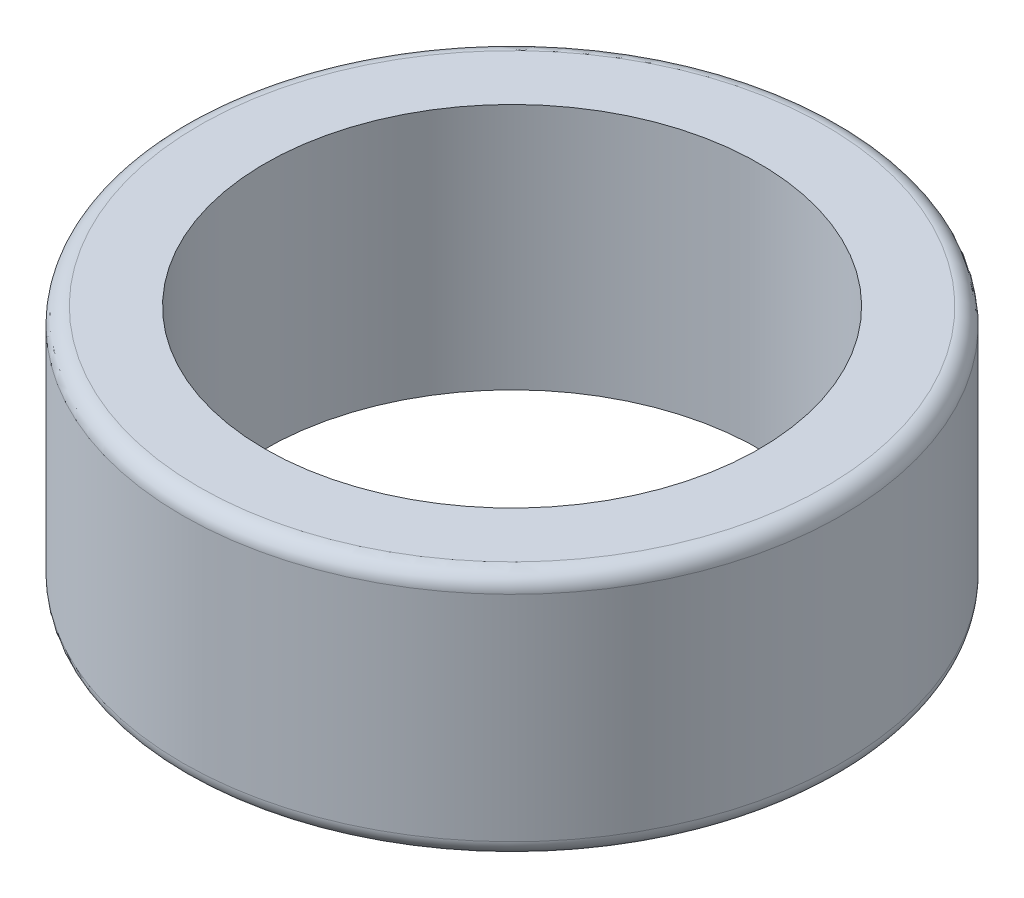
ISO-10303-21;
HEADER;
FILE_DESCRIPTION(('STEP AP214'),'2;1');
FILE_NAME('part.step','',(''),(''),'','','');
FILE_SCHEMA(('AUTOMOTIVE_DESIGN { 1 0 10303 214 1 1 1 1 }'));
ENDSEC;
DATA;
#1=APPLICATION_CONTEXT('core data for automotive mechanical design processes');
#2=APPLICATION_PROTOCOL_DEFINITION('international standard','automotive_design',2000,#1);
#3=PRODUCT_CONTEXT('',#1,'mechanical');
#4=PRODUCT('Part','Part','',(#3));
#5=PRODUCT_RELATED_PRODUCT_CATEGORY('part','',(#4));
#6=PRODUCT_DEFINITION_FORMATION('','',#4);
#7=PRODUCT_DEFINITION_CONTEXT('part definition',#1,'design');
#8=PRODUCT_DEFINITION('design','',#6,#7);
#9=PRODUCT_DEFINITION_SHAPE('','',#8);
#10=(LENGTH_UNIT() NAMED_UNIT(*) SI_UNIT(.MILLI.,.METRE.));
#11=(NAMED_UNIT(*) PLANE_ANGLE_UNIT() SI_UNIT($,.RADIAN.));
#12=(NAMED_UNIT(*) SI_UNIT($,.STERADIAN.) SOLID_ANGLE_UNIT());
#13=UNCERTAINTY_MEASURE_WITH_UNIT(LENGTH_MEASURE(1.E-05),#10,'distance_accuracy_value','');
#14=(GEOMETRIC_REPRESENTATION_CONTEXT(3) GLOBAL_UNCERTAINTY_ASSIGNED_CONTEXT((#13)) GLOBAL_UNIT_ASSIGNED_CONTEXT((#10,
#11,#12)) REPRESENTATION_CONTEXT('',''));
#15=CARTESIAN_POINT('',(0.,0.,0.));
#16=DIRECTION('',(0.,0.,1.));
#17=DIRECTION('',(1.,0.,0.));
#18=AXIS2_PLACEMENT_3D('',#15,#16,#17);
#19=CARTESIAN_POINT('',(0.,3.,0.));
#20=DIRECTION('',(0.,1.,0.));
#21=DIRECTION('',(0.,0.,1.));
#22=AXIS2_PLACEMENT_3D('',#19,#20,#21);
#23=PLANE('',#22);
#24=CARTESIAN_POINT('',(0.,3.,0.));
#25=DIRECTION('',(0.,1.,0.));
#26=DIRECTION('',(0.,0.,1.));
#27=AXIS2_PLACEMENT_3D('',#24,#25,#26);
#28=CIRCLE('',#27,3.8);
#29=CARTESIAN_POINT('',(0.,3.,3.8));
#30=VERTEX_POINT('',#29);
#31=EDGE_CURVE('E10',#30,#30,#28,.T.);
#32=ORIENTED_EDGE('',*,*,#31,.T.);
#33=EDGE_LOOP('',(#32));
#34=FACE_BOUND('',#33,.T.);
#35=CARTESIAN_POINT('',(0.,3.,0.));
#36=DIRECTION('',(0.,1.,0.));
#37=DIRECTION('',(0.,0.,1.));
#38=AXIS2_PLACEMENT_3D('',#35,#36,#37);
#39=CIRCLE('',#38,3.);
#40=CARTESIAN_POINT('',(0.,3.,3.));
#41=VERTEX_POINT('',#40);
#42=EDGE_CURVE('E51',#41,#41,#39,.T.);
#43=ORIENTED_EDGE('',*,*,#42,.F.);
#44=EDGE_LOOP('',(#43));
#45=FACE_BOUND('',#44,.T.);
#46=ADVANCED_FACE('F31',(#34,#45),#23,.T.);
#47=CARTESIAN_POINT('',(0.,0.,0.));
#48=DIRECTION('',(0.,1.,0.));
#49=DIRECTION('',(0.,0.,1.));
#50=AXIS2_PLACEMENT_3D('',#47,#48,#49);
#51=PLANE('',#50);
#52=CARTESIAN_POINT('',(0.,0.,0.));
#53=DIRECTION('',(0.,1.,0.));
#54=DIRECTION('',(0.,0.,1.));
#55=AXIS2_PLACEMENT_3D('',#52,#53,#54);
#56=CIRCLE('',#55,3.8);
#57=CARTESIAN_POINT('',(0.,0.,3.8));
#58=VERTEX_POINT('',#57);
#59=EDGE_CURVE('E38',#58,#58,#56,.F.);
#60=ORIENTED_EDGE('',*,*,#59,.T.);
#61=EDGE_LOOP('',(#60));
#62=FACE_BOUND('',#61,.T.);
#63=CARTESIAN_POINT('',(0.,0.,0.));
#64=DIRECTION('',(0.,1.,0.));
#65=DIRECTION('',(0.,0.,1.));
#66=AXIS2_PLACEMENT_3D('',#63,#64,#65);
#67=CIRCLE('',#66,3.);
#68=CARTESIAN_POINT('',(0.,0.,3.));
#69=VERTEX_POINT('',#68);
#70=EDGE_CURVE('E52',#69,#69,#67,.T.);
#71=ORIENTED_EDGE('',*,*,#70,.T.);
#72=EDGE_LOOP('',(#71));
#73=FACE_BOUND('',#72,.T.);
#74=ADVANCED_FACE('F62',(#62,#73),#51,.F.);
#75=CARTESIAN_POINT('',(0.,3.,0.));
#76=DIRECTION('',(0.,-1.,0.));
#77=DIRECTION('',(0.,0.,-1.));
#78=AXIS2_PLACEMENT_3D('',#75,#76,#77);
#79=CYLINDRICAL_SURFACE('',#78,4.);
#80=CARTESIAN_POINT('',(0.,0.2,0.));
#81=DIRECTION('',(0.,1.,0.));
#82=DIRECTION('',(0.,0.,1.));
#83=AXIS2_PLACEMENT_3D('',#80,#81,#82);
#84=CIRCLE('',#83,4.);
#85=CARTESIAN_POINT('',(0.,0.2,4.));
#86=VERTEX_POINT('',#85);
#87=EDGE_CURVE('E42',#86,#86,#84,.T.);
#88=ORIENTED_EDGE('',*,*,#87,.T.);
#89=EDGE_LOOP('',(#88));
#90=FACE_BOUND('',#89,.T.);
#91=CARTESIAN_POINT('',(0.,2.8,0.));
#92=DIRECTION('',(0.,1.,0.));
#93=DIRECTION('',(0.,0.,1.));
#94=AXIS2_PLACEMENT_3D('',#91,#92,#93);
#95=CIRCLE('',#94,4.);
#96=CARTESIAN_POINT('',(0.,2.8,4.));
#97=VERTEX_POINT('',#96);
#98=EDGE_CURVE('E46',#97,#97,#95,.F.);
#99=ORIENTED_EDGE('',*,*,#98,.T.);
#100=EDGE_LOOP('',(#99));
#101=FACE_BOUND('',#100,.T.);
#102=ADVANCED_FACE('F68',(#90,#101),#79,.T.);
#103=CARTESIAN_POINT('',(0.,3.,0.));
#104=DIRECTION('',(0.,-1.,0.));
#105=DIRECTION('',(0.,0.,-1.));
#106=AXIS2_PLACEMENT_3D('',#103,#104,#105);
#107=CYLINDRICAL_SURFACE('',#106,3.);
#108=ORIENTED_EDGE('',*,*,#42,.T.);
#109=EDGE_LOOP('',(#108));
#110=FACE_BOUND('',#109,.T.);
#111=ORIENTED_EDGE('',*,*,#70,.F.);
#112=EDGE_LOOP('',(#111));
#113=FACE_BOUND('',#112,.T.);
#114=ADVANCED_FACE('F58',(#110,#113),#107,.F.);
#115=CARTESIAN_POINT('',(0.,0.2,0.));
#116=DIRECTION('',(0.,1.,0.));
#117=DIRECTION('',(0.,0.,1.));
#118=AXIS2_PLACEMENT_3D('',#115,#116,#117);
#119=TOROIDAL_SURFACE('',#118,3.8,0.2);
#120=ORIENTED_EDGE('',*,*,#59,.F.);
#121=EDGE_LOOP('',(#120));
#122=FACE_BOUND('',#121,.T.);
#123=ORIENTED_EDGE('',*,*,#87,.F.);
#124=EDGE_LOOP('',(#123));
#125=FACE_BOUND('',#124,.T.);
#126=ADVANCED_FACE('F74',(#122,#125),#119,.T.);
#127=CARTESIAN_POINT('',(0.,2.8,0.));
#128=DIRECTION('',(0.,1.,0.));
#129=DIRECTION('',(0.,0.,1.));
#130=AXIS2_PLACEMENT_3D('',#127,#128,#129);
#131=TOROIDAL_SURFACE('',#130,3.8,0.2);
#132=ORIENTED_EDGE('',*,*,#98,.F.);
#133=EDGE_LOOP('',(#132));
#134=FACE_BOUND('',#133,.T.);
#135=ORIENTED_EDGE('',*,*,#31,.F.);
#136=EDGE_LOOP('',(#135));
#137=FACE_BOUND('',#136,.T.);
#138=ADVANCED_FACE('F33',(#134,#137),#131,.T.);
#139=CLOSED_SHELL('',(#46,#74,#102,#114,#126,#138));
#140=MANIFOLD_SOLID_BREP('B2',#139);
#141=ADVANCED_BREP_SHAPE_REPRESENTATION('',(#18,#140),#14);
#142=SHAPE_DEFINITION_REPRESENTATION(#9,#141);
ENDSEC;
END-ISO-10303-21;
